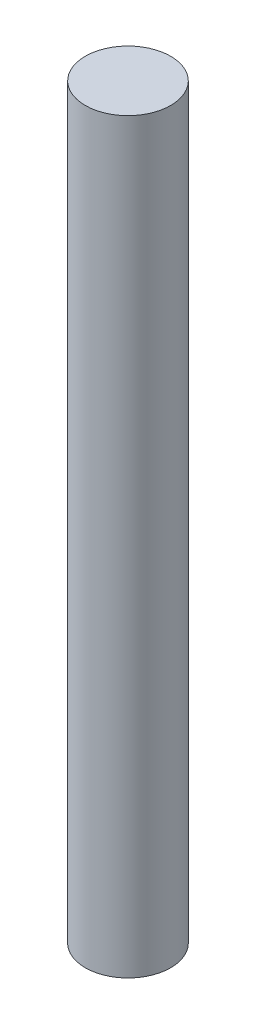
ISO-10303-21;
HEADER;
FILE_DESCRIPTION(('STEP AP214'),'2;1');
FILE_NAME('part.step','',(''),(''),'','','');
FILE_SCHEMA(('AUTOMOTIVE_DESIGN { 1 0 10303 214 1 1 1 1 }'));
ENDSEC;
DATA;
#1=APPLICATION_CONTEXT('core data for automotive mechanical design processes');
#2=APPLICATION_PROTOCOL_DEFINITION('international standard','automotive_design',2000,#1);
#3=PRODUCT_CONTEXT('',#1,'mechanical');
#4=PRODUCT('Part','Part','',(#3));
#5=PRODUCT_RELATED_PRODUCT_CATEGORY('part','',(#4));
#6=PRODUCT_DEFINITION_FORMATION('','',#4);
#7=PRODUCT_DEFINITION_CONTEXT('part definition',#1,'design');
#8=PRODUCT_DEFINITION('design','',#6,#7);
#9=PRODUCT_DEFINITION_SHAPE('','',#8);
#10=(LENGTH_UNIT() NAMED_UNIT(*) SI_UNIT(.MILLI.,.METRE.));
#11=(NAMED_UNIT(*) PLANE_ANGLE_UNIT() SI_UNIT($,.RADIAN.));
#12=(NAMED_UNIT(*) SI_UNIT($,.STERADIAN.) SOLID_ANGLE_UNIT());
#13=UNCERTAINTY_MEASURE_WITH_UNIT(LENGTH_MEASURE(1.E-05),#10,'distance_accuracy_value','');
#14=(GEOMETRIC_REPRESENTATION_CONTEXT(3) GLOBAL_UNCERTAINTY_ASSIGNED_CONTEXT((#13)) GLOBAL_UNIT_ASSIGNED_CONTEXT((#10,
#11,#12)) REPRESENTATION_CONTEXT('',''));
#15=CARTESIAN_POINT('',(0.,0.,0.));
#16=DIRECTION('',(0.,0.,1.));
#17=DIRECTION('',(1.,0.,0.));
#18=AXIS2_PLACEMENT_3D('',#15,#16,#17);
#19=CARTESIAN_POINT('',(0.,70000.,0.));
#20=DIRECTION('',(0.,-1.,0.));
#21=DIRECTION('',(0.,0.,-1.));
#22=AXIS2_PLACEMENT_3D('',#19,#20,#21);
#23=CYLINDRICAL_SURFACE('',#22,4000.);
#24=CARTESIAN_POINT('',(0.,70000.,0.));
#25=DIRECTION('',(0.,1.,0.));
#26=DIRECTION('',(0.,0.,1.));
#27=AXIS2_PLACEMENT_3D('',#24,#25,#26);
#28=CIRCLE('',#27,4000.);
#29=CARTESIAN_POINT('',(0.,70000.,4000.));
#30=VERTEX_POINT('',#29);
#31=EDGE_CURVE('E10',#30,#30,#28,.T.);
#32=ORIENTED_EDGE('',*,*,#31,.F.);
#33=EDGE_LOOP('',(#32));
#34=FACE_BOUND('',#33,.T.);
#35=CARTESIAN_POINT('',(0.,0.,0.));
#36=DIRECTION('',(0.,1.,0.));
#37=DIRECTION('',(0.,0.,1.));
#38=AXIS2_PLACEMENT_3D('',#35,#36,#37);
#39=CIRCLE('',#38,4000.);
#40=CARTESIAN_POINT('',(0.,0.,4000.));
#41=VERTEX_POINT('',#40);
#42=EDGE_CURVE('E34',#41,#41,#39,.T.);
#43=ORIENTED_EDGE('',*,*,#42,.T.);
#44=EDGE_LOOP('',(#43));
#45=FACE_BOUND('',#44,.T.);
#46=ADVANCED_FACE('F31',(#34,#45),#23,.T.);
#47=CARTESIAN_POINT('',(0.,70000.,0.));
#48=DIRECTION('',(0.,1.,0.));
#49=DIRECTION('',(0.,0.,1.));
#50=AXIS2_PLACEMENT_3D('',#47,#48,#49);
#51=PLANE('',#50);
#52=ORIENTED_EDGE('',*,*,#31,.T.);
#53=EDGE_LOOP('',(#52));
#54=FACE_BOUND('',#53,.T.);
#55=ADVANCED_FACE('F46',(#54),#51,.T.);
#56=CARTESIAN_POINT('',(0.,0.,0.));
#57=DIRECTION('',(0.,1.,0.));
#58=DIRECTION('',(0.,0.,1.));
#59=AXIS2_PLACEMENT_3D('',#56,#57,#58);
#60=PLANE('',#59);
#61=ORIENTED_EDGE('',*,*,#42,.F.);
#62=EDGE_LOOP('',(#61));
#63=FACE_BOUND('',#62,.T.);
#64=ADVANCED_FACE('F44',(#63),#60,.F.);
#65=CLOSED_SHELL('',(#46,#55,#64));
#66=MANIFOLD_SOLID_BREP('B2',#65);
#67=ADVANCED_BREP_SHAPE_REPRESENTATION('',(#18,#66),#14);
#68=SHAPE_DEFINITION_REPRESENTATION(#9,#67);
ENDSEC;
END-ISO-10303-21;
